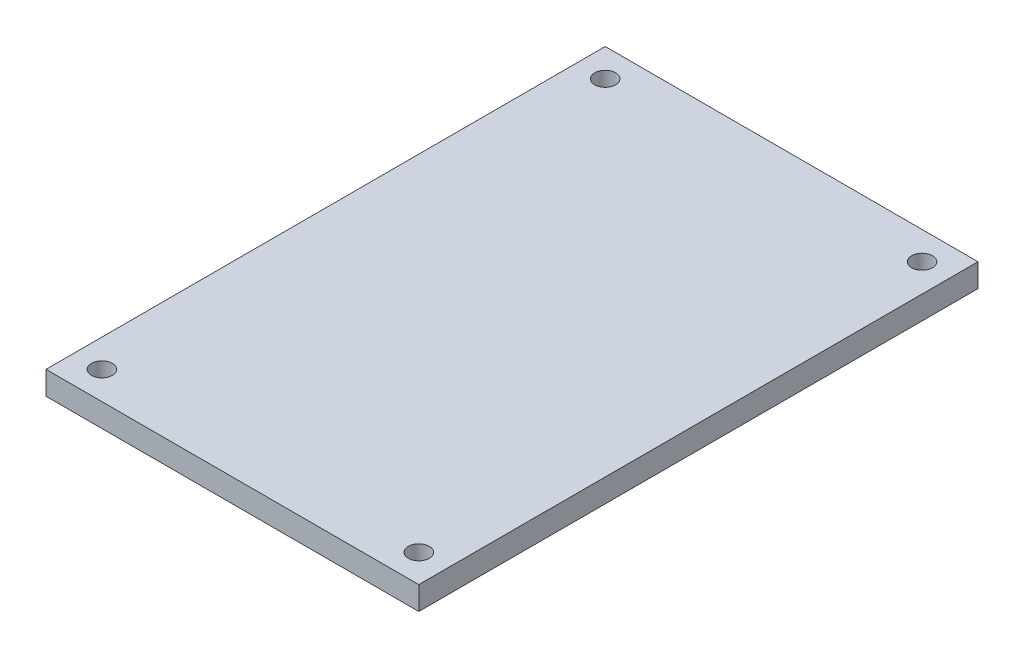
ISO-10303-21;
HEADER;
FILE_DESCRIPTION(('STEP AP214'),'2;1');
FILE_NAME('part.step','',(''),(''),'','','');
FILE_SCHEMA(('AUTOMOTIVE_DESIGN { 1 0 10303 214 1 1 1 1 }'));
ENDSEC;
DATA;
#1=APPLICATION_CONTEXT('core data for automotive mechanical design processes');
#2=APPLICATION_PROTOCOL_DEFINITION('international standard','automotive_design',2000,#1);
#3=PRODUCT_CONTEXT('',#1,'mechanical');
#4=PRODUCT('Part','Part','',(#3));
#5=PRODUCT_RELATED_PRODUCT_CATEGORY('part','',(#4));
#6=PRODUCT_DEFINITION_FORMATION('','',#4);
#7=PRODUCT_DEFINITION_CONTEXT('part definition',#1,'design');
#8=PRODUCT_DEFINITION('design','',#6,#7);
#9=PRODUCT_DEFINITION_SHAPE('','',#8);
#10=(LENGTH_UNIT() NAMED_UNIT(*) SI_UNIT(.MILLI.,.METRE.));
#11=(NAMED_UNIT(*) PLANE_ANGLE_UNIT() SI_UNIT($,.RADIAN.));
#12=(NAMED_UNIT(*) SI_UNIT($,.STERADIAN.) SOLID_ANGLE_UNIT());
#13=UNCERTAINTY_MEASURE_WITH_UNIT(LENGTH_MEASURE(1.E-05),#10,'distance_accuracy_value','');
#14=(GEOMETRIC_REPRESENTATION_CONTEXT(3) GLOBAL_UNCERTAINTY_ASSIGNED_CONTEXT((#13)) GLOBAL_UNIT_ASSIGNED_CONTEXT((#10,
#11,#12)) REPRESENTATION_CONTEXT('',''));
#15=CARTESIAN_POINT('',(0.,0.,0.));
#16=DIRECTION('',(0.,0.,1.));
#17=DIRECTION('',(1.,0.,0.));
#18=AXIS2_PLACEMENT_3D('',#15,#16,#17);
#19=CARTESIAN_POINT('',(0.,3.175,0.));
#20=DIRECTION('',(0.,-1.,0.));
#21=DIRECTION('',(0.,0.,-1.));
#22=AXIS2_PLACEMENT_3D('',#19,#20,#21);
#23=PLANE('',#22);
#24=DIRECTION('',(0.,0.,1.));
#25=VECTOR('',#24,1.);
#26=CARTESIAN_POINT('',(0.,3.175,0.));
#27=LINE('',#26,#25);
#28=CARTESIAN_POINT('',(0.,3.175,-76.2));
#29=VERTEX_POINT('',#28);
#30=CARTESIAN_POINT('',(0.,3.175,0.));
#31=VERTEX_POINT('',#30);
#32=EDGE_CURVE('E92',#29,#31,#27,.T.);
#33=ORIENTED_EDGE('',*,*,#32,.T.);
#34=DIRECTION('',(1.,0.,0.));
#35=VECTOR('',#34,1.);
#36=CARTESIAN_POINT('',(0.,3.175,0.));
#37=LINE('',#36,#35);
#38=CARTESIAN_POINT('',(50.8,3.175,0.));
#39=VERTEX_POINT('',#38);
#40=EDGE_CURVE('E87',#31,#39,#37,.T.);
#41=ORIENTED_EDGE('',*,*,#40,.T.);
#42=DIRECTION('',(0.,0.,-1.));
#43=VECTOR('',#42,1.);
#44=CARTESIAN_POINT('',(50.8,3.175,0.));
#45=LINE('',#44,#43);
#46=CARTESIAN_POINT('',(50.8,3.175,-76.2));
#47=VERTEX_POINT('',#46);
#48=EDGE_CURVE('E90',#39,#47,#45,.T.);
#49=ORIENTED_EDGE('',*,*,#48,.T.);
#50=DIRECTION('',(-1.,0.,0.));
#51=VECTOR('',#50,1.);
#52=CARTESIAN_POINT('',(0.,3.175,-76.2));
#53=LINE('',#52,#51);
#54=EDGE_CURVE('E57',#47,#29,#53,.T.);
#55=ORIENTED_EDGE('',*,*,#54,.T.);
#56=EDGE_LOOP('',(#33,#41,#49,#55));
#57=FACE_BOUND('',#56,.T.);
#58=CARTESIAN_POINT('',(3.81,3.175,-3.81));
#59=DIRECTION('',(0.,1.,0.));
#60=DIRECTION('',(0.,0.,1.));
#61=AXIS2_PLACEMENT_3D('',#58,#59,#60);
#62=CIRCLE('',#61,1.4224);
#63=CARTESIAN_POINT('',(3.81,3.175,-2.3876));
#64=VERTEX_POINT('',#63);
#65=EDGE_CURVE('E112',#64,#64,#62,.T.);
#66=ORIENTED_EDGE('',*,*,#65,.F.);
#67=EDGE_LOOP('',(#66));
#68=FACE_BOUND('',#67,.T.);
#69=CARTESIAN_POINT('',(3.81,3.175,-72.39));
#70=DIRECTION('',(0.,1.,0.));
#71=DIRECTION('',(0.,0.,-1.));
#72=AXIS2_PLACEMENT_3D('',#69,#70,#71);
#73=CIRCLE('',#72,1.4224);
#74=CARTESIAN_POINT('',(3.81,3.175,-73.8124));
#75=VERTEX_POINT('',#74);
#76=EDGE_CURVE('E134',#75,#75,#73,.T.);
#77=ORIENTED_EDGE('',*,*,#76,.F.);
#78=EDGE_LOOP('',(#77));
#79=FACE_BOUND('',#78,.T.);
#80=CARTESIAN_POINT('',(46.99,3.175,-3.81000000000006));
#81=DIRECTION('',(0.,1.,0.));
#82=DIRECTION('',(0.,0.,-1.));
#83=AXIS2_PLACEMENT_3D('',#80,#81,#82);
#84=CIRCLE('',#83,1.4224);
#85=CARTESIAN_POINT('',(46.99,3.175,-5.23240000000006));
#86=VERTEX_POINT('',#85);
#87=EDGE_CURVE('E142',#86,#86,#84,.T.);
#88=ORIENTED_EDGE('',*,*,#87,.F.);
#89=EDGE_LOOP('',(#88));
#90=FACE_BOUND('',#89,.T.);
#91=CARTESIAN_POINT('',(46.99,3.175,-72.39));
#92=DIRECTION('',(0.,1.,0.));
#93=DIRECTION('',(0.,0.,1.));
#94=AXIS2_PLACEMENT_3D('',#91,#92,#93);
#95=CIRCLE('',#94,1.4224);
#96=CARTESIAN_POINT('',(46.99,3.175,-70.9676));
#97=VERTEX_POINT('',#96);
#98=EDGE_CURVE('E150',#97,#97,#95,.T.);
#99=ORIENTED_EDGE('',*,*,#98,.F.);
#100=EDGE_LOOP('',(#99));
#101=FACE_BOUND('',#100,.T.);
#102=ADVANCED_FACE('F39',(#57,#68,#79,#90,#101),#23,.F.);
#103=CARTESIAN_POINT('',(0.,0.,0.));
#104=DIRECTION('',(0.,-1.,0.));
#105=DIRECTION('',(0.,0.,-1.));
#106=AXIS2_PLACEMENT_3D('',#103,#104,#105);
#107=PLANE('',#106);
#108=CARTESIAN_POINT('',(46.99,0.,-3.81000000000006));
#109=DIRECTION('',(0.,1.,0.));
#110=DIRECTION('',(0.,0.,-1.));
#111=AXIS2_PLACEMENT_3D('',#108,#109,#110);
#112=CIRCLE('',#111,1.4224);
#113=CARTESIAN_POINT('',(46.99,0.,-5.23240000000006));
#114=VERTEX_POINT('',#113);
#115=EDGE_CURVE('E146',#114,#114,#112,.T.);
#116=ORIENTED_EDGE('',*,*,#115,.T.);
#117=EDGE_LOOP('',(#116));
#118=FACE_BOUND('',#117,.T.);
#119=CARTESIAN_POINT('',(3.81,0.,-3.81));
#120=DIRECTION('',(0.,1.,0.));
#121=DIRECTION('',(0.,0.,1.));
#122=AXIS2_PLACEMENT_3D('',#119,#120,#121);
#123=CIRCLE('',#122,1.4224);
#124=CARTESIAN_POINT('',(3.81,0.,-2.3876));
#125=VERTEX_POINT('',#124);
#126=EDGE_CURVE('E130',#125,#125,#123,.T.);
#127=ORIENTED_EDGE('',*,*,#126,.T.);
#128=EDGE_LOOP('',(#127));
#129=FACE_BOUND('',#128,.T.);
#130=DIRECTION('',(0.,0.,1.));
#131=VECTOR('',#130,1.);
#132=CARTESIAN_POINT('',(0.,0.,0.));
#133=LINE('',#132,#131);
#134=CARTESIAN_POINT('',(0.,0.,-76.2));
#135=VERTEX_POINT('',#134);
#136=CARTESIAN_POINT('',(0.,0.,0.));
#137=VERTEX_POINT('',#136);
#138=EDGE_CURVE('E108',#135,#137,#133,.T.);
#139=ORIENTED_EDGE('',*,*,#138,.F.);
#140=DIRECTION('',(-1.,0.,0.));
#141=VECTOR('',#140,1.);
#142=CARTESIAN_POINT('',(0.,0.,-76.2));
#143=LINE('',#142,#141);
#144=CARTESIAN_POINT('',(50.8,0.,-76.2));
#145=VERTEX_POINT('',#144);
#146=EDGE_CURVE('E80',#145,#135,#143,.T.);
#147=ORIENTED_EDGE('',*,*,#146,.F.);
#148=DIRECTION('',(0.,0.,-1.));
#149=VECTOR('',#148,1.);
#150=CARTESIAN_POINT('',(50.8,0.,0.));
#151=LINE('',#150,#149);
#152=CARTESIAN_POINT('',(50.8,0.,0.));
#153=VERTEX_POINT('',#152);
#154=EDGE_CURVE('E74',#153,#145,#151,.T.);
#155=ORIENTED_EDGE('',*,*,#154,.F.);
#156=DIRECTION('',(1.,0.,0.));
#157=VECTOR('',#156,1.);
#158=CARTESIAN_POINT('',(0.,0.,0.));
#159=LINE('',#158,#157);
#160=EDGE_CURVE('E97',#137,#153,#159,.T.);
#161=ORIENTED_EDGE('',*,*,#160,.F.);
#162=EDGE_LOOP('',(#139,#147,#155,#161));
#163=FACE_BOUND('',#162,.T.);
#164=CARTESIAN_POINT('',(3.81,0.,-72.39));
#165=DIRECTION('',(0.,1.,0.));
#166=DIRECTION('',(0.,0.,-1.));
#167=AXIS2_PLACEMENT_3D('',#164,#165,#166);
#168=CIRCLE('',#167,1.4224);
#169=CARTESIAN_POINT('',(3.81,0.,-73.8124));
#170=VERTEX_POINT('',#169);
#171=EDGE_CURVE('E138',#170,#170,#168,.T.);
#172=ORIENTED_EDGE('',*,*,#171,.T.);
#173=EDGE_LOOP('',(#172));
#174=FACE_BOUND('',#173,.T.);
#175=CARTESIAN_POINT('',(46.99,0.,-72.39));
#176=DIRECTION('',(0.,1.,0.));
#177=DIRECTION('',(0.,0.,1.));
#178=AXIS2_PLACEMENT_3D('',#175,#176,#177);
#179=CIRCLE('',#178,1.4224);
#180=CARTESIAN_POINT('',(46.99,0.,-70.9676));
#181=VERTEX_POINT('',#180);
#182=EDGE_CURVE('E154',#181,#181,#179,.T.);
#183=ORIENTED_EDGE('',*,*,#182,.T.);
#184=EDGE_LOOP('',(#183));
#185=FACE_BOUND('',#184,.T.);
#186=ADVANCED_FACE('F125',(#118,#129,#163,#174,#185),#107,.T.);
#187=CARTESIAN_POINT('',(0.,3.175,0.));
#188=DIRECTION('',(1.,0.,0.));
#189=DIRECTION('',(0.,0.,-1.));
#190=AXIS2_PLACEMENT_3D('',#187,#188,#189);
#191=PLANE('',#190);
#192=ORIENTED_EDGE('',*,*,#138,.T.);
#193=DIRECTION('',(0.,-1.,0.));
#194=VECTOR('',#193,1.);
#195=CARTESIAN_POINT('',(0.,3.175,0.));
#196=LINE('',#195,#194);
#197=EDGE_CURVE('E11',#31,#137,#196,.T.);
#198=ORIENTED_EDGE('',*,*,#197,.F.);
#199=ORIENTED_EDGE('',*,*,#32,.F.);
#200=DIRECTION('',(0.,-1.,0.));
#201=VECTOR('',#200,1.);
#202=CARTESIAN_POINT('',(0.,3.175,-76.2));
#203=LINE('',#202,#201);
#204=EDGE_CURVE('E104',#29,#135,#203,.T.);
#205=ORIENTED_EDGE('',*,*,#204,.T.);
#206=EDGE_LOOP('',(#192,#198,#199,#205));
#207=FACE_BOUND('',#206,.T.);
#208=ADVANCED_FACE('F41',(#207),#191,.F.);
#209=CARTESIAN_POINT('',(0.,3.175,0.));
#210=DIRECTION('',(0.,0.,-1.));
#211=DIRECTION('',(-1.,0.,0.));
#212=AXIS2_PLACEMENT_3D('',#209,#210,#211);
#213=PLANE('',#212);
#214=ORIENTED_EDGE('',*,*,#160,.T.);
#215=DIRECTION('',(0.,-1.,0.));
#216=VECTOR('',#215,1.);
#217=CARTESIAN_POINT('',(50.8,3.175,0.));
#218=LINE('',#217,#216);
#219=EDGE_CURVE('E49',#39,#153,#218,.T.);
#220=ORIENTED_EDGE('',*,*,#219,.F.);
#221=ORIENTED_EDGE('',*,*,#40,.F.);
#222=ORIENTED_EDGE('',*,*,#197,.T.);
#223=EDGE_LOOP('',(#214,#220,#221,#222));
#224=FACE_BOUND('',#223,.T.);
#225=ADVANCED_FACE('F96',(#224),#213,.F.);
#226=CARTESIAN_POINT('',(50.8,3.175,0.));
#227=DIRECTION('',(-1.,0.,0.));
#228=DIRECTION('',(0.,0.,1.));
#229=AXIS2_PLACEMENT_3D('',#226,#227,#228);
#230=PLANE('',#229);
#231=ORIENTED_EDGE('',*,*,#154,.T.);
#232=DIRECTION('',(0.,-1.,0.));
#233=VECTOR('',#232,1.);
#234=CARTESIAN_POINT('',(50.8,3.175,-76.2));
#235=LINE('',#234,#233);
#236=EDGE_CURVE('E99',#47,#145,#235,.T.);
#237=ORIENTED_EDGE('',*,*,#236,.F.);
#238=ORIENTED_EDGE('',*,*,#48,.F.);
#239=ORIENTED_EDGE('',*,*,#219,.T.);
#240=EDGE_LOOP('',(#231,#237,#238,#239));
#241=FACE_BOUND('',#240,.T.);
#242=ADVANCED_FACE('F100',(#241),#230,.F.);
#243=CARTESIAN_POINT('',(0.,3.175,-76.2));
#244=DIRECTION('',(0.,0.,1.));
#245=DIRECTION('',(1.,0.,0.));
#246=AXIS2_PLACEMENT_3D('',#243,#244,#245);
#247=PLANE('',#246);
#248=ORIENTED_EDGE('',*,*,#146,.T.);
#249=ORIENTED_EDGE('',*,*,#204,.F.);
#250=ORIENTED_EDGE('',*,*,#54,.F.);
#251=ORIENTED_EDGE('',*,*,#236,.T.);
#252=EDGE_LOOP('',(#248,#249,#250,#251));
#253=FACE_BOUND('',#252,.T.);
#254=ADVANCED_FACE('F122',(#253),#247,.F.);
#255=CARTESIAN_POINT('',(3.81,3.175,-3.81));
#256=DIRECTION('',(0.,-1.,0.));
#257=DIRECTION('',(0.,0.,-1.));
#258=AXIS2_PLACEMENT_3D('',#255,#256,#257);
#259=CYLINDRICAL_SURFACE('',#258,1.4224);
#260=ORIENTED_EDGE('',*,*,#65,.T.);
#261=EDGE_LOOP('',(#260));
#262=FACE_BOUND('',#261,.T.);
#263=ORIENTED_EDGE('',*,*,#126,.F.);
#264=EDGE_LOOP('',(#263));
#265=FACE_BOUND('',#264,.T.);
#266=ADVANCED_FACE('F173',(#262,#265),#259,.F.);
#267=CARTESIAN_POINT('',(3.81,3.175,-72.39));
#268=DIRECTION('',(0.,-1.,0.));
#269=DIRECTION('',(0.,0.,-1.));
#270=AXIS2_PLACEMENT_3D('',#267,#268,#269);
#271=CYLINDRICAL_SURFACE('',#270,1.4224);
#272=ORIENTED_EDGE('',*,*,#76,.T.);
#273=EDGE_LOOP('',(#272));
#274=FACE_BOUND('',#273,.T.);
#275=ORIENTED_EDGE('',*,*,#171,.F.);
#276=EDGE_LOOP('',(#275));
#277=FACE_BOUND('',#276,.T.);
#278=ADVANCED_FACE('F219',(#274,#277),#271,.F.);
#279=CARTESIAN_POINT('',(46.99,3.175,-3.81000000000006));
#280=DIRECTION('',(0.,-1.,0.));
#281=DIRECTION('',(0.,0.,-1.));
#282=AXIS2_PLACEMENT_3D('',#279,#280,#281);
#283=CYLINDRICAL_SURFACE('',#282,1.4224);
#284=ORIENTED_EDGE('',*,*,#87,.T.);
#285=EDGE_LOOP('',(#284));
#286=FACE_BOUND('',#285,.T.);
#287=ORIENTED_EDGE('',*,*,#115,.F.);
#288=EDGE_LOOP('',(#287));
#289=FACE_BOUND('',#288,.T.);
#290=ADVANCED_FACE('F227',(#286,#289),#283,.F.);
#291=CARTESIAN_POINT('',(46.99,3.175,-72.39));
#292=DIRECTION('',(0.,-1.,0.));
#293=DIRECTION('',(0.,0.,-1.));
#294=AXIS2_PLACEMENT_3D('',#291,#292,#293);
#295=CYLINDRICAL_SURFACE('',#294,1.4224);
#296=ORIENTED_EDGE('',*,*,#98,.T.);
#297=EDGE_LOOP('',(#296));
#298=FACE_BOUND('',#297,.T.);
#299=ORIENTED_EDGE('',*,*,#182,.F.);
#300=EDGE_LOOP('',(#299));
#301=FACE_BOUND('',#300,.T.);
#302=ADVANCED_FACE('F162',(#298,#301),#295,.F.);
#303=CLOSED_SHELL('',(#102,#186,#208,#225,#242,#254,#266,#278,#290,#302));
#304=MANIFOLD_SOLID_BREP('B2',#303);
#305=ADVANCED_BREP_SHAPE_REPRESENTATION('',(#18,#304),#14);
#306=SHAPE_DEFINITION_REPRESENTATION(#9,#305);
ENDSEC;
END-ISO-10303-21;
